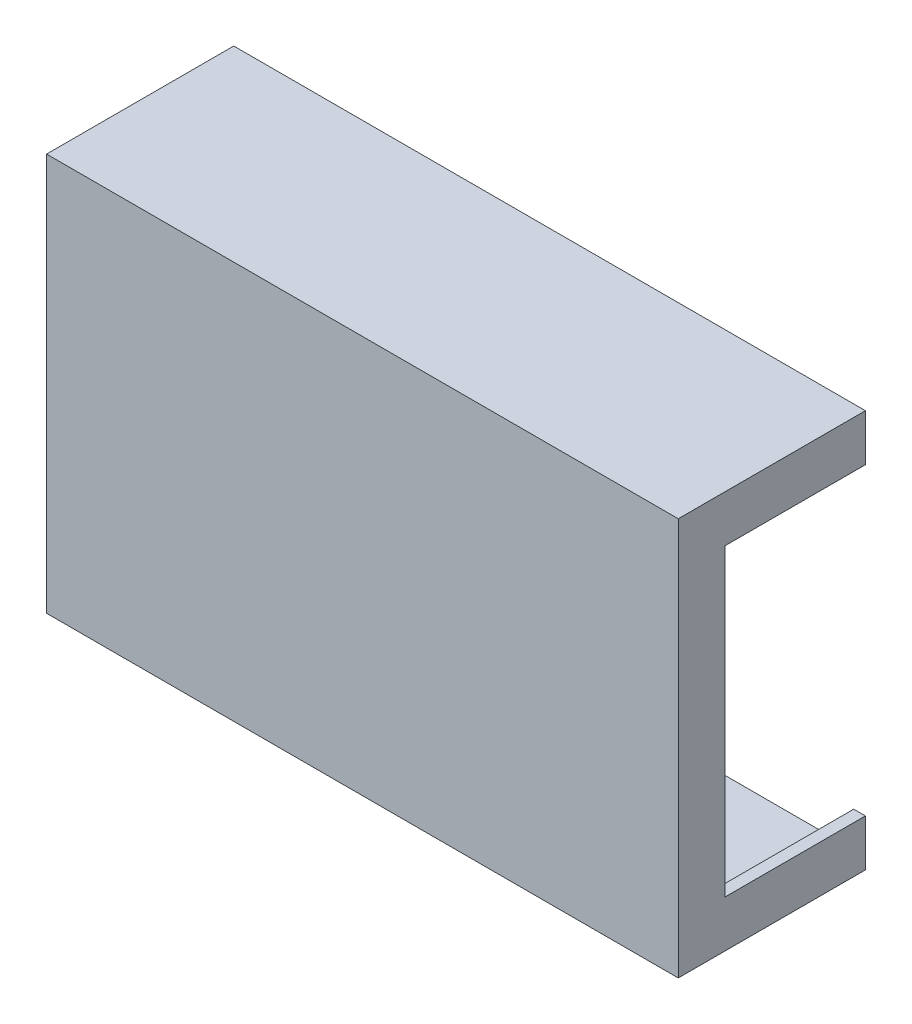
ISO-10303-21;
HEADER;
FILE_DESCRIPTION(('STEP AP214'),'2;1');
FILE_NAME('part.step','',(''),(''),'','','');
FILE_SCHEMA(('AUTOMOTIVE_DESIGN { 1 0 10303 214 1 1 1 1 }'));
ENDSEC;
DATA;
#1=APPLICATION_CONTEXT('core data for automotive mechanical design processes');
#2=APPLICATION_PROTOCOL_DEFINITION('international standard','automotive_design',2000,#1);
#3=PRODUCT_CONTEXT('',#1,'mechanical');
#4=PRODUCT('Part','Part','',(#3));
#5=PRODUCT_RELATED_PRODUCT_CATEGORY('part','',(#4));
#6=PRODUCT_DEFINITION_FORMATION('','',#4);
#7=PRODUCT_DEFINITION_CONTEXT('part definition',#1,'design');
#8=PRODUCT_DEFINITION('design','',#6,#7);
#9=PRODUCT_DEFINITION_SHAPE('','',#8);
#10=(LENGTH_UNIT() NAMED_UNIT(*) SI_UNIT(.MILLI.,.METRE.));
#11=(NAMED_UNIT(*) PLANE_ANGLE_UNIT() SI_UNIT($,.RADIAN.));
#12=(NAMED_UNIT(*) SI_UNIT($,.STERADIAN.) SOLID_ANGLE_UNIT());
#13=UNCERTAINTY_MEASURE_WITH_UNIT(LENGTH_MEASURE(1.E-05),#10,'distance_accuracy_value','');
#14=(GEOMETRIC_REPRESENTATION_CONTEXT(3) GLOBAL_UNCERTAINTY_ASSIGNED_CONTEXT((#13)) GLOBAL_UNIT_ASSIGNED_CONTEXT((#10,
#11,#12)) REPRESENTATION_CONTEXT('',''));
#15=CARTESIAN_POINT('',(0.,0.,0.));
#16=DIRECTION('',(0.,0.,1.));
#17=DIRECTION('',(1.,0.,0.));
#18=AXIS2_PLACEMENT_3D('',#15,#16,#17);
#19=CARTESIAN_POINT('',(0.,0.,-70.));
#20=DIRECTION('',(0.,0.,1.));
#21=DIRECTION('',(1.,0.,0.));
#22=AXIS2_PLACEMENT_3D('',#19,#20,#21);
#23=PLANE('',#22);
#24=DIRECTION('',(0.,1.,0.));
#25=VECTOR('',#24,1.);
#26=CARTESIAN_POINT('',(-135.,-85.,-70.));
#27=LINE('',#26,#25);
#28=CARTESIAN_POINT('',(-135.,-85.,-70.));
#29=VERTEX_POINT('',#28);
#30=CARTESIAN_POINT('',(-135.,-65.,-70.));
#31=VERTEX_POINT('',#30);
#32=EDGE_CURVE('E173',#29,#31,#27,.T.);
#33=ORIENTED_EDGE('',*,*,#32,.T.);
#34=DIRECTION('',(1.,0.,0.));
#35=VECTOR('',#34,1.);
#36=CARTESIAN_POINT('',(-135.,-65.,-70.));
#37=LINE('',#36,#35);
#38=CARTESIAN_POINT('',(-130.,-65.,-70.));
#39=VERTEX_POINT('',#38);
#40=EDGE_CURVE('E236',#31,#39,#37,.T.);
#41=ORIENTED_EDGE('',*,*,#40,.T.);
#42=DIRECTION('',(0.,1.,0.));
#43=VECTOR('',#42,1.);
#44=CARTESIAN_POINT('',(-130.,-80.,-70.));
#45=LINE('',#44,#43);
#46=CARTESIAN_POINT('',(-130.,-80.,-70.));
#47=VERTEX_POINT('',#46);
#48=EDGE_CURVE('E248',#47,#39,#45,.T.);
#49=ORIENTED_EDGE('',*,*,#48,.F.);
#50=DIRECTION('',(-1.,0.,0.));
#51=VECTOR('',#50,1.);
#52=CARTESIAN_POINT('',(130.,-80.,-70.));
#53=LINE('',#52,#51);
#54=CARTESIAN_POINT('',(130.,-80.,-70.));
#55=VERTEX_POINT('',#54);
#56=EDGE_CURVE('E255',#55,#47,#53,.T.);
#57=ORIENTED_EDGE('',*,*,#56,.F.);
#58=DIRECTION('',(0.,-1.,0.));
#59=VECTOR('',#58,1.);
#60=CARTESIAN_POINT('',(130.,-80.,-70.));
#61=LINE('',#60,#59);
#62=CARTESIAN_POINT('',(130.,-65.,-70.));
#63=VERTEX_POINT('',#62);
#64=EDGE_CURVE('E253',#63,#55,#61,.T.);
#65=ORIENTED_EDGE('',*,*,#64,.F.);
#66=CARTESIAN_POINT('',(135.,-65.,-70.));
#67=VERTEX_POINT('',#66);
#68=EDGE_CURVE('E299',#63,#67,#37,.T.);
#69=ORIENTED_EDGE('',*,*,#68,.T.);
#70=DIRECTION('',(0.,-1.,0.));
#71=VECTOR('',#70,1.);
#72=CARTESIAN_POINT('',(135.,-85.,-70.));
#73=LINE('',#72,#71);
#74=CARTESIAN_POINT('',(135.,-85.,-70.));
#75=VERTEX_POINT('',#74);
#76=EDGE_CURVE('E184',#67,#75,#73,.T.);
#77=ORIENTED_EDGE('',*,*,#76,.T.);
#78=DIRECTION('',(-1.,0.,0.));
#79=VECTOR('',#78,1.);
#80=CARTESIAN_POINT('',(135.,-85.,-70.));
#81=LINE('',#80,#79);
#82=EDGE_CURVE('E187',#75,#29,#81,.T.);
#83=ORIENTED_EDGE('',*,*,#82,.T.);
#84=EDGE_LOOP('',(#33,#41,#49,#57,#65,#69,#77,#83));
#85=FACE_BOUND('',#84,.T.);
#86=ADVANCED_FACE('F37',(#85),#23,.F.);
#87=CARTESIAN_POINT('',(135.,-85.,10.));
#88=DIRECTION('',(-1.,0.,0.));
#89=DIRECTION('',(0.,0.,1.));
#90=AXIS2_PLACEMENT_3D('',#87,#88,#89);
#91=PLANE('',#90);
#92=ORIENTED_EDGE('',*,*,#76,.F.);
#93=DIRECTION('',(0.,0.,1.));
#94=VECTOR('',#93,1.);
#95=CARTESIAN_POINT('',(135.,-65.,9.99999999999999));
#96=LINE('',#95,#94);
#97=CARTESIAN_POINT('',(135.,-65.,-10.));
#98=VERTEX_POINT('',#97);
#99=EDGE_CURVE('E244',#67,#98,#96,.T.);
#100=ORIENTED_EDGE('',*,*,#99,.T.);
#101=DIRECTION('',(0.,1.,0.));
#102=VECTOR('',#101,1.);
#103=CARTESIAN_POINT('',(135.,-85.,-10.));
#104=LINE('',#103,#102);
#105=CARTESIAN_POINT('',(135.,65.,-9.99999999999999));
#106=VERTEX_POINT('',#105);
#107=EDGE_CURVE('E240',#98,#106,#104,.T.);
#108=ORIENTED_EDGE('',*,*,#107,.T.);
#109=DIRECTION('',(0.,0.,-1.));
#110=VECTOR('',#109,1.);
#111=CARTESIAN_POINT('',(135.,65.,10.));
#112=LINE('',#111,#110);
#113=CARTESIAN_POINT('',(135.,65.,-70.));
#114=VERTEX_POINT('',#113);
#115=EDGE_CURVE('E235',#106,#114,#112,.T.);
#116=ORIENTED_EDGE('',*,*,#115,.T.);
#117=CARTESIAN_POINT('',(135.,85.,-70.));
#118=VERTEX_POINT('',#117);
#119=EDGE_CURVE('E185',#118,#114,#73,.T.);
#120=ORIENTED_EDGE('',*,*,#119,.F.);
#121=DIRECTION('',(0.,0.,-1.));
#122=VECTOR('',#121,1.);
#123=CARTESIAN_POINT('',(135.,85.,10.));
#124=LINE('',#123,#122);
#125=CARTESIAN_POINT('',(135.,85.,10.));
#126=VERTEX_POINT('',#125);
#127=EDGE_CURVE('E205',#126,#118,#124,.T.);
#128=ORIENTED_EDGE('',*,*,#127,.F.);
#129=DIRECTION('',(0.,1.,0.));
#130=VECTOR('',#129,1.);
#131=CARTESIAN_POINT('',(135.,-85.,10.));
#132=LINE('',#131,#130);
#133=CARTESIAN_POINT('',(135.,-85.,10.));
#134=VERTEX_POINT('',#133);
#135=EDGE_CURVE('E190',#134,#126,#132,.T.);
#136=ORIENTED_EDGE('',*,*,#135,.F.);
#137=DIRECTION('',(0.,0.,-1.));
#138=VECTOR('',#137,1.);
#139=CARTESIAN_POINT('',(135.,-85.,10.));
#140=LINE('',#139,#138);
#141=EDGE_CURVE('E199',#134,#75,#140,.T.);
#142=ORIENTED_EDGE('',*,*,#141,.T.);
#143=EDGE_LOOP('',(#92,#100,#108,#116,#120,#128,#136,#142));
#144=FACE_BOUND('',#143,.T.);
#145=ADVANCED_FACE('F39',(#144),#91,.F.);
#146=CARTESIAN_POINT('',(-135.,85.,10.));
#147=DIRECTION('',(0.,-1.,0.));
#148=DIRECTION('',(0.,0.,-1.));
#149=AXIS2_PLACEMENT_3D('',#146,#147,#148);
#150=PLANE('',#149);
#151=ORIENTED_EDGE('',*,*,#127,.T.);
#152=DIRECTION('',(1.,0.,0.));
#153=VECTOR('',#152,1.);
#154=CARTESIAN_POINT('',(135.,85.,-70.));
#155=LINE('',#154,#153);
#156=CARTESIAN_POINT('',(-135.,85.,-70.));
#157=VERTEX_POINT('',#156);
#158=EDGE_CURVE('E177',#157,#118,#155,.T.);
#159=ORIENTED_EDGE('',*,*,#158,.F.);
#160=DIRECTION('',(0.,0.,-1.));
#161=VECTOR('',#160,1.);
#162=CARTESIAN_POINT('',(-135.,85.,10.));
#163=LINE('',#162,#161);
#164=CARTESIAN_POINT('',(-135.,85.,10.));
#165=VERTEX_POINT('',#164);
#166=EDGE_CURVE('E171',#165,#157,#163,.T.);
#167=ORIENTED_EDGE('',*,*,#166,.F.);
#168=DIRECTION('',(-1.,0.,0.));
#169=VECTOR('',#168,1.);
#170=CARTESIAN_POINT('',(-135.,85.,10.));
#171=LINE('',#170,#169);
#172=EDGE_CURVE('E193',#126,#165,#171,.T.);
#173=ORIENTED_EDGE('',*,*,#172,.F.);
#174=EDGE_LOOP('',(#151,#159,#167,#173));
#175=FACE_BOUND('',#174,.T.);
#176=ADVANCED_FACE('F319',(#175),#150,.F.);
#177=CARTESIAN_POINT('',(-135.,-85.,10.));
#178=DIRECTION('',(1.,0.,0.));
#179=DIRECTION('',(0.,0.,-1.));
#180=AXIS2_PLACEMENT_3D('',#177,#178,#179);
#181=PLANE('',#180);
#182=DIRECTION('',(0.,-1.,0.));
#183=VECTOR('',#182,1.);
#184=CARTESIAN_POINT('',(-135.,65.,-9.99999999999999));
#185=LINE('',#184,#183);
#186=CARTESIAN_POINT('',(-135.,65.,-9.99999999999999));
#187=VERTEX_POINT('',#186);
#188=CARTESIAN_POINT('',(-135.,-65.,-10.));
#189=VERTEX_POINT('',#188);
#190=EDGE_CURVE('E155',#187,#189,#185,.T.);
#191=ORIENTED_EDGE('',*,*,#190,.T.);
#192=DIRECTION('',(0.,0.,-1.));
#193=VECTOR('',#192,1.);
#194=CARTESIAN_POINT('',(-135.,-65.,-10.));
#195=LINE('',#194,#193);
#196=EDGE_CURVE('E227',#189,#31,#195,.T.);
#197=ORIENTED_EDGE('',*,*,#196,.T.);
#198=ORIENTED_EDGE('',*,*,#32,.F.);
#199=DIRECTION('',(0.,0.,-1.));
#200=VECTOR('',#199,1.);
#201=CARTESIAN_POINT('',(-135.,-85.,10.));
#202=LINE('',#201,#200);
#203=CARTESIAN_POINT('',(-135.,-85.,10.));
#204=VERTEX_POINT('',#203);
#205=EDGE_CURVE('E202',#204,#29,#202,.T.);
#206=ORIENTED_EDGE('',*,*,#205,.F.);
#207=DIRECTION('',(0.,-1.,0.));
#208=VECTOR('',#207,1.);
#209=CARTESIAN_POINT('',(-135.,-85.,10.));
#210=LINE('',#209,#208);
#211=EDGE_CURVE('E195',#165,#204,#210,.T.);
#212=ORIENTED_EDGE('',*,*,#211,.F.);
#213=ORIENTED_EDGE('',*,*,#166,.T.);
#214=CARTESIAN_POINT('',(-135.,65.,-70.));
#215=VERTEX_POINT('',#214);
#216=EDGE_CURVE('E162',#215,#157,#27,.T.);
#217=ORIENTED_EDGE('',*,*,#216,.F.);
#218=DIRECTION('',(0.,0.,1.));
#219=VECTOR('',#218,1.);
#220=CARTESIAN_POINT('',(-135.,65.,-70.));
#221=LINE('',#220,#219);
#222=EDGE_CURVE('E147',#215,#187,#221,.T.);
#223=ORIENTED_EDGE('',*,*,#222,.T.);
#224=EDGE_LOOP('',(#191,#197,#198,#206,#212,#213,#217,#223));
#225=FACE_BOUND('',#224,.T.);
#226=ADVANCED_FACE('F168',(#225),#181,.F.);
#227=CARTESIAN_POINT('',(-135.,-85.,10.));
#228=DIRECTION('',(0.,1.,0.));
#229=DIRECTION('',(0.,0.,1.));
#230=AXIS2_PLACEMENT_3D('',#227,#228,#229);
#231=PLANE('',#230);
#232=ORIENTED_EDGE('',*,*,#205,.T.);
#233=ORIENTED_EDGE('',*,*,#82,.F.);
#234=ORIENTED_EDGE('',*,*,#141,.F.);
#235=DIRECTION('',(1.,0.,0.));
#236=VECTOR('',#235,1.);
#237=CARTESIAN_POINT('',(-135.,-85.,10.));
#238=LINE('',#237,#236);
#239=EDGE_CURVE('E197',#204,#134,#238,.T.);
#240=ORIENTED_EDGE('',*,*,#239,.F.);
#241=EDGE_LOOP('',(#232,#233,#234,#240));
#242=FACE_BOUND('',#241,.T.);
#243=ADVANCED_FACE('F329',(#242),#231,.F.);
#244=CARTESIAN_POINT('',(0.,0.,10.));
#245=DIRECTION('',(0.,0.,-1.));
#246=DIRECTION('',(-1.,0.,0.));
#247=AXIS2_PLACEMENT_3D('',#244,#245,#246);
#248=PLANE('',#247);
#249=ORIENTED_EDGE('',*,*,#135,.T.);
#250=ORIENTED_EDGE('',*,*,#172,.T.);
#251=ORIENTED_EDGE('',*,*,#211,.T.);
#252=ORIENTED_EDGE('',*,*,#239,.T.);
#253=EDGE_LOOP('',(#249,#250,#251,#252));
#254=FACE_BOUND('',#253,.T.);
#255=ADVANCED_FACE('F324',(#254),#248,.F.);
#256=ORIENTED_EDGE('',*,*,#119,.T.);
#257=DIRECTION('',(1.,0.,0.));
#258=VECTOR('',#257,1.);
#259=CARTESIAN_POINT('',(-135.,65.,-70.));
#260=LINE('',#259,#258);
#261=CARTESIAN_POINT('',(130.,65.,-70.));
#262=VERTEX_POINT('',#261);
#263=EDGE_CURVE('E166',#262,#114,#260,.T.);
#264=ORIENTED_EDGE('',*,*,#263,.F.);
#265=CARTESIAN_POINT('',(130.,80.,-70.));
#266=VERTEX_POINT('',#265);
#267=EDGE_CURVE('E222',#266,#262,#61,.T.);
#268=ORIENTED_EDGE('',*,*,#267,.F.);
#269=DIRECTION('',(1.,0.,0.));
#270=VECTOR('',#269,1.);
#271=CARTESIAN_POINT('',(130.,80.,-70.));
#272=LINE('',#271,#270);
#273=CARTESIAN_POINT('',(-130.,80.,-70.));
#274=VERTEX_POINT('',#273);
#275=EDGE_CURVE('E251',#274,#266,#272,.T.);
#276=ORIENTED_EDGE('',*,*,#275,.F.);
#277=CARTESIAN_POINT('',(-130.,65.,-70.));
#278=VERTEX_POINT('',#277);
#279=EDGE_CURVE('E165',#278,#274,#45,.T.);
#280=ORIENTED_EDGE('',*,*,#279,.F.);
#281=EDGE_CURVE('E52',#215,#278,#260,.T.);
#282=ORIENTED_EDGE('',*,*,#281,.F.);
#283=ORIENTED_EDGE('',*,*,#216,.T.);
#284=ORIENTED_EDGE('',*,*,#158,.T.);
#285=EDGE_LOOP('',(#256,#264,#268,#276,#280,#282,#283,#284));
#286=FACE_BOUND('',#285,.T.);
#287=ADVANCED_FACE('F160',(#286),#23,.F.);
#288=CARTESIAN_POINT('',(-130.,-80.,-70.));
#289=DIRECTION('',(1.,0.,0.));
#290=DIRECTION('',(0.,0.,-1.));
#291=AXIS2_PLACEMENT_3D('',#288,#289,#290);
#292=PLANE('',#291);
#293=DIRECTION('',(0.,0.,-1.));
#294=VECTOR('',#293,1.);
#295=CARTESIAN_POINT('',(-130.,-65.,-70.));
#296=LINE('',#295,#294);
#297=CARTESIAN_POINT('',(-130.,-65.,-10.));
#298=VERTEX_POINT('',#297);
#299=EDGE_CURVE('E242',#298,#39,#296,.T.);
#300=ORIENTED_EDGE('',*,*,#299,.F.);
#301=DIRECTION('',(0.,-1.,0.));
#302=VECTOR('',#301,1.);
#303=CARTESIAN_POINT('',(-130.,-80.,-10.));
#304=LINE('',#303,#302);
#305=CARTESIAN_POINT('',(-130.,65.,-9.99999999999999));
#306=VERTEX_POINT('',#305);
#307=EDGE_CURVE('E238',#306,#298,#304,.T.);
#308=ORIENTED_EDGE('',*,*,#307,.F.);
#309=DIRECTION('',(0.,0.,1.));
#310=VECTOR('',#309,1.);
#311=CARTESIAN_POINT('',(-130.,65.,-70.));
#312=LINE('',#311,#310);
#313=EDGE_CURVE('E233',#278,#306,#312,.T.);
#314=ORIENTED_EDGE('',*,*,#313,.F.);
#315=ORIENTED_EDGE('',*,*,#279,.T.);
#316=DIRECTION('',(0.,0.,1.));
#317=VECTOR('',#316,1.);
#318=CARTESIAN_POINT('',(-130.,80.,-70.));
#319=LINE('',#318,#317);
#320=CARTESIAN_POINT('',(-130.,80.,0.));
#321=VERTEX_POINT('',#320);
#322=EDGE_CURVE('E174',#274,#321,#319,.T.);
#323=ORIENTED_EDGE('',*,*,#322,.T.);
#324=DIRECTION('',(0.,1.,0.));
#325=VECTOR('',#324,1.);
#326=CARTESIAN_POINT('',(-130.,-80.,0.));
#327=LINE('',#326,#325);
#328=CARTESIAN_POINT('',(-130.,-80.,0.));
#329=VERTEX_POINT('',#328);
#330=EDGE_CURVE('E247',#329,#321,#327,.T.);
#331=ORIENTED_EDGE('',*,*,#330,.F.);
#332=DIRECTION('',(0.,0.,1.));
#333=VECTOR('',#332,1.);
#334=CARTESIAN_POINT('',(-130.,-80.,-70.));
#335=LINE('',#334,#333);
#336=EDGE_CURVE('E257',#47,#329,#335,.T.);
#337=ORIENTED_EDGE('',*,*,#336,.F.);
#338=ORIENTED_EDGE('',*,*,#48,.T.);
#339=EDGE_LOOP('',(#300,#308,#314,#315,#323,#331,#337,#338));
#340=FACE_BOUND('',#339,.T.);
#341=ADVANCED_FACE('F283',(#340),#292,.T.);
#342=CARTESIAN_POINT('',(130.,80.,-70.));
#343=DIRECTION('',(0.,-1.,0.));
#344=DIRECTION('',(0.,0.,-1.));
#345=AXIS2_PLACEMENT_3D('',#342,#343,#344);
#346=PLANE('',#345);
#347=DIRECTION('',(1.,0.,0.));
#348=VECTOR('',#347,1.);
#349=CARTESIAN_POINT('',(130.,80.,0.));
#350=LINE('',#349,#348);
#351=CARTESIAN_POINT('',(130.,80.,0.));
#352=VERTEX_POINT('',#351);
#353=EDGE_CURVE('E259',#321,#352,#350,.T.);
#354=ORIENTED_EDGE('',*,*,#353,.F.);
#355=ORIENTED_EDGE('',*,*,#322,.F.);
#356=ORIENTED_EDGE('',*,*,#275,.T.);
#357=DIRECTION('',(0.,0.,1.));
#358=VECTOR('',#357,1.);
#359=CARTESIAN_POINT('',(130.,80.,-70.));
#360=LINE('',#359,#358);
#361=EDGE_CURVE('E179',#266,#352,#360,.T.);
#362=ORIENTED_EDGE('',*,*,#361,.T.);
#363=EDGE_LOOP('',(#354,#355,#356,#362));
#364=FACE_BOUND('',#363,.T.);
#365=ADVANCED_FACE('F273',(#364),#346,.T.);
#366=CARTESIAN_POINT('',(130.,-80.,-70.));
#367=DIRECTION('',(-1.,0.,0.));
#368=DIRECTION('',(0.,0.,1.));
#369=AXIS2_PLACEMENT_3D('',#366,#367,#368);
#370=PLANE('',#369);
#371=DIRECTION('',(0.,0.,1.));
#372=VECTOR('',#371,1.);
#373=CARTESIAN_POINT('',(130.,-65.,-70.));
#374=LINE('',#373,#372);
#375=CARTESIAN_POINT('',(130.,-65.,-10.));
#376=VERTEX_POINT('',#375);
#377=EDGE_CURVE('E11',#63,#376,#374,.T.);
#378=ORIENTED_EDGE('',*,*,#377,.F.);
#379=ORIENTED_EDGE('',*,*,#64,.T.);
#380=DIRECTION('',(0.,0.,1.));
#381=VECTOR('',#380,1.);
#382=CARTESIAN_POINT('',(130.,-80.,-70.));
#383=LINE('',#382,#381);
#384=CARTESIAN_POINT('',(130.,-80.,0.));
#385=VERTEX_POINT('',#384);
#386=EDGE_CURVE('E267',#55,#385,#383,.T.);
#387=ORIENTED_EDGE('',*,*,#386,.T.);
#388=DIRECTION('',(0.,-1.,0.));
#389=VECTOR('',#388,1.);
#390=CARTESIAN_POINT('',(130.,-80.,0.));
#391=LINE('',#390,#389);
#392=EDGE_CURVE('E261',#352,#385,#391,.T.);
#393=ORIENTED_EDGE('',*,*,#392,.F.);
#394=ORIENTED_EDGE('',*,*,#361,.F.);
#395=ORIENTED_EDGE('',*,*,#267,.T.);
#396=DIRECTION('',(0.,0.,-1.));
#397=VECTOR('',#396,1.);
#398=CARTESIAN_POINT('',(130.,65.,-70.));
#399=LINE('',#398,#397);
#400=CARTESIAN_POINT('',(130.,65.,-9.99999999999999));
#401=VERTEX_POINT('',#400);
#402=EDGE_CURVE('E207',#401,#262,#399,.T.);
#403=ORIENTED_EDGE('',*,*,#402,.F.);
#404=DIRECTION('',(0.,1.,0.));
#405=VECTOR('',#404,1.);
#406=CARTESIAN_POINT('',(130.,-80.,-10.));
#407=LINE('',#406,#405);
#408=EDGE_CURVE('E45',#376,#401,#407,.T.);
#409=ORIENTED_EDGE('',*,*,#408,.F.);
#410=EDGE_LOOP('',(#378,#379,#387,#393,#394,#395,#403,#409));
#411=FACE_BOUND('',#410,.T.);
#412=ADVANCED_FACE('F219',(#411),#370,.T.);
#413=CARTESIAN_POINT('',(130.,-80.,-70.));
#414=DIRECTION('',(0.,1.,0.));
#415=DIRECTION('',(0.,0.,1.));
#416=AXIS2_PLACEMENT_3D('',#413,#414,#415);
#417=PLANE('',#416);
#418=DIRECTION('',(-1.,0.,0.));
#419=VECTOR('',#418,1.);
#420=CARTESIAN_POINT('',(130.,-80.,0.));
#421=LINE('',#420,#419);
#422=EDGE_CURVE('E263',#385,#329,#421,.T.);
#423=ORIENTED_EDGE('',*,*,#422,.F.);
#424=ORIENTED_EDGE('',*,*,#386,.F.);
#425=ORIENTED_EDGE('',*,*,#56,.T.);
#426=ORIENTED_EDGE('',*,*,#336,.T.);
#427=EDGE_LOOP('',(#423,#424,#425,#426));
#428=FACE_BOUND('',#427,.T.);
#429=ADVANCED_FACE('F286',(#428),#417,.T.);
#430=CARTESIAN_POINT('',(0.,0.,0.));
#431=DIRECTION('',(0.,0.,-1.));
#432=DIRECTION('',(-1.,0.,0.));
#433=AXIS2_PLACEMENT_3D('',#430,#431,#432);
#434=PLANE('',#433);
#435=ORIENTED_EDGE('',*,*,#330,.T.);
#436=ORIENTED_EDGE('',*,*,#353,.T.);
#437=ORIENTED_EDGE('',*,*,#392,.T.);
#438=ORIENTED_EDGE('',*,*,#422,.T.);
#439=EDGE_LOOP('',(#435,#436,#437,#438));
#440=FACE_BOUND('',#439,.T.);
#441=ADVANCED_FACE('F278',(#440),#434,.T.);
#442=CARTESIAN_POINT('',(-135.,65.,-70.));
#443=DIRECTION('',(0.,1.,0.));
#444=DIRECTION('',(0.,0.,1.));
#445=AXIS2_PLACEMENT_3D('',#442,#443,#444);
#446=PLANE('',#445);
#447=DIRECTION('',(1.,0.,0.));
#448=VECTOR('',#447,1.);
#449=CARTESIAN_POINT('',(-135.,65.,-9.99999999999999));
#450=LINE('',#449,#448);
#451=EDGE_CURVE('E60',#401,#106,#450,.T.);
#452=ORIENTED_EDGE('',*,*,#451,.F.);
#453=ORIENTED_EDGE('',*,*,#402,.T.);
#454=ORIENTED_EDGE('',*,*,#263,.T.);
#455=ORIENTED_EDGE('',*,*,#115,.F.);
#456=EDGE_LOOP('',(#452,#453,#454,#455));
#457=FACE_BOUND('',#456,.T.);
#458=ADVANCED_FACE('F224',(#457),#446,.F.);
#459=CARTESIAN_POINT('',(-135.,65.,-9.99999999999999));
#460=DIRECTION('',(0.,0.,1.));
#461=DIRECTION('',(0.,-1.,0.));
#462=AXIS2_PLACEMENT_3D('',#459,#460,#461);
#463=PLANE('',#462);
#464=DIRECTION('',(1.,0.,0.));
#465=VECTOR('',#464,1.);
#466=CARTESIAN_POINT('',(-135.,-65.,-10.));
#467=LINE('',#466,#465);
#468=EDGE_CURVE('E215',#376,#98,#467,.T.);
#469=ORIENTED_EDGE('',*,*,#468,.F.);
#470=ORIENTED_EDGE('',*,*,#408,.T.);
#471=ORIENTED_EDGE('',*,*,#451,.T.);
#472=ORIENTED_EDGE('',*,*,#107,.F.);
#473=EDGE_LOOP('',(#469,#470,#471,#472));
#474=FACE_BOUND('',#473,.T.);
#475=ADVANCED_FACE('F212',(#474),#463,.F.);
#476=CARTESIAN_POINT('',(-135.,-65.,-10.));
#477=DIRECTION('',(0.,-1.,0.));
#478=DIRECTION('',(0.,0.,-1.));
#479=AXIS2_PLACEMENT_3D('',#476,#477,#478);
#480=PLANE('',#479);
#481=ORIENTED_EDGE('',*,*,#68,.F.);
#482=ORIENTED_EDGE('',*,*,#377,.T.);
#483=ORIENTED_EDGE('',*,*,#468,.T.);
#484=ORIENTED_EDGE('',*,*,#99,.F.);
#485=EDGE_LOOP('',(#481,#482,#483,#484));
#486=FACE_BOUND('',#485,.T.);
#487=ADVANCED_FACE('F311',(#486),#480,.F.);
#488=ORIENTED_EDGE('',*,*,#299,.T.);
#489=ORIENTED_EDGE('',*,*,#40,.F.);
#490=ORIENTED_EDGE('',*,*,#196,.F.);
#491=EDGE_CURVE('E297',#189,#298,#467,.T.);
#492=ORIENTED_EDGE('',*,*,#491,.T.);
#493=EDGE_LOOP('',(#488,#489,#490,#492));
#494=FACE_BOUND('',#493,.T.);
#495=ADVANCED_FACE('F295',(#494),#480,.F.);
#496=ORIENTED_EDGE('',*,*,#307,.T.);
#497=ORIENTED_EDGE('',*,*,#491,.F.);
#498=ORIENTED_EDGE('',*,*,#190,.F.);
#499=EDGE_CURVE('E150',#187,#306,#450,.T.);
#500=ORIENTED_EDGE('',*,*,#499,.T.);
#501=EDGE_LOOP('',(#496,#497,#498,#500));
#502=FACE_BOUND('',#501,.T.);
#503=ADVANCED_FACE('F303',(#502),#463,.F.);
#504=ORIENTED_EDGE('',*,*,#313,.T.);
#505=ORIENTED_EDGE('',*,*,#499,.F.);
#506=ORIENTED_EDGE('',*,*,#222,.F.);
#507=ORIENTED_EDGE('',*,*,#281,.T.);
#508=EDGE_LOOP('',(#504,#505,#506,#507));
#509=FACE_BOUND('',#508,.T.);
#510=ADVANCED_FACE('F148',(#509),#446,.F.);
#511=CLOSED_SHELL('',(#86,#145,#176,#226,#243,#255,#287,#341,#365,#412,#429,#441,#458,#475,#487,
#495,#503,#510));
#512=MANIFOLD_SOLID_BREP('B2',#511);
#513=ADVANCED_BREP_SHAPE_REPRESENTATION('',(#18,#512),#14);
#514=SHAPE_DEFINITION_REPRESENTATION(#9,#513);
ENDSEC;
END-ISO-10303-21;
